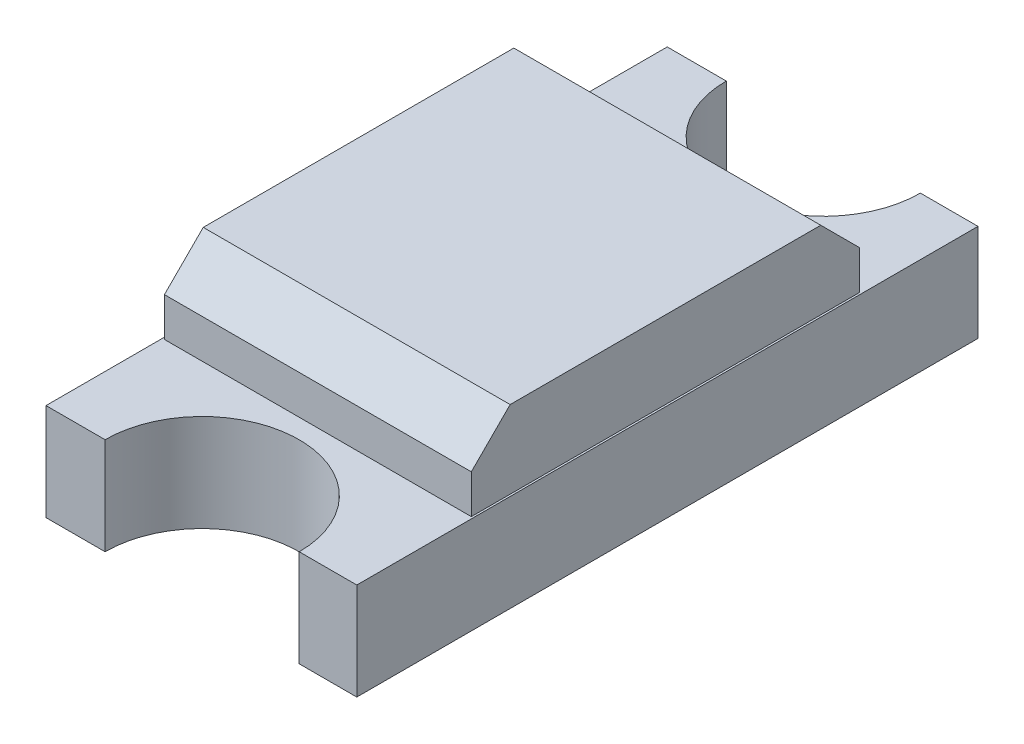
ISO-10303-21;
HEADER;
FILE_DESCRIPTION(('STEP AP214'),'2;1');
FILE_NAME('part.step','',(''),(''),'','','');
FILE_SCHEMA(('AUTOMOTIVE_DESIGN { 1 0 10303 214 1 1 1 1 }'));
ENDSEC;
DATA;
#1=APPLICATION_CONTEXT('core data for automotive mechanical design processes');
#2=APPLICATION_PROTOCOL_DEFINITION('international standard','automotive_design',2000,#1);
#3=PRODUCT_CONTEXT('',#1,'mechanical');
#4=PRODUCT('Part','Part','',(#3));
#5=PRODUCT_RELATED_PRODUCT_CATEGORY('part','',(#4));
#6=PRODUCT_DEFINITION_FORMATION('','',#4);
#7=PRODUCT_DEFINITION_CONTEXT('part definition',#1,'design');
#8=PRODUCT_DEFINITION('design','',#6,#7);
#9=PRODUCT_DEFINITION_SHAPE('','',#8);
#10=(LENGTH_UNIT() NAMED_UNIT(*) SI_UNIT(.MILLI.,.METRE.));
#11=(NAMED_UNIT(*) PLANE_ANGLE_UNIT() SI_UNIT($,.RADIAN.));
#12=(NAMED_UNIT(*) SI_UNIT($,.STERADIAN.) SOLID_ANGLE_UNIT());
#13=UNCERTAINTY_MEASURE_WITH_UNIT(LENGTH_MEASURE(1.E-05),#10,'distance_accuracy_value','');
#14=(GEOMETRIC_REPRESENTATION_CONTEXT(3) GLOBAL_UNCERTAINTY_ASSIGNED_CONTEXT((#13)) GLOBAL_UNIT_ASSIGNED_CONTEXT((#10,
#11,#12)) REPRESENTATION_CONTEXT('',''));
#15=CARTESIAN_POINT('',(0.,0.,0.));
#16=DIRECTION('',(0.,0.,1.));
#17=DIRECTION('',(1.,0.,0.));
#18=AXIS2_PLACEMENT_3D('',#15,#16,#17);
#19=CARTESIAN_POINT('',(0.,0.5,0.));
#20=DIRECTION('',(0.,-1.,0.));
#21=DIRECTION('',(0.,0.,-1.));
#22=AXIS2_PLACEMENT_3D('',#19,#20,#21);
#23=PLANE('',#22);
#24=CARTESIAN_POINT('',(0.,0.5,0.));
#25=DIRECTION('',(0.,-1.,0.));
#26=DIRECTION('',(0.,0.,-1.));
#27=AXIS2_PLACEMENT_3D('',#24,#25,#26);
#28=CIRCLE('',#27,0.5);
#29=CARTESIAN_POINT('',(0.5,0.5,0.));
#30=VERTEX_POINT('',#29);
#31=CARTESIAN_POINT('',(-0.5,0.5,0.));
#32=VERTEX_POINT('',#31);
#33=EDGE_CURVE('E168',#30,#32,#28,.T.);
#34=ORIENTED_EDGE('',*,*,#33,.T.);
#35=DIRECTION('',(-1.,0.,0.));
#36=VECTOR('',#35,1.);
#37=CARTESIAN_POINT('',(-0.5,0.5,0.));
#38=LINE('',#37,#36);
#39=CARTESIAN_POINT('',(-0.804342602210729,0.5,0.));
#40=VERTEX_POINT('',#39);
#41=EDGE_CURVE('E171',#32,#40,#38,.T.);
#42=ORIENTED_EDGE('',*,*,#41,.T.);
#43=DIRECTION('',(0.,0.,1.));
#44=VECTOR('',#43,1.);
#45=CARTESIAN_POINT('',(-0.804342602210729,0.5,0.));
#46=LINE('',#45,#44);
#47=CARTESIAN_POINT('',(-0.804342602210729,0.5,3.2));
#48=VERTEX_POINT('',#47);
#49=EDGE_CURVE('E174',#40,#48,#46,.T.);
#50=ORIENTED_EDGE('',*,*,#49,.T.);
#51=DIRECTION('',(1.,0.,0.));
#52=VECTOR('',#51,1.);
#53=CARTESIAN_POINT('',(-0.804342602210729,0.5,3.2));
#54=LINE('',#53,#52);
#55=CARTESIAN_POINT('',(-0.5,0.5,3.2));
#56=VERTEX_POINT('',#55);
#57=EDGE_CURVE('E176',#48,#56,#54,.T.);
#58=ORIENTED_EDGE('',*,*,#57,.T.);
#59=CARTESIAN_POINT('',(0.,0.5,3.2));
#60=DIRECTION('',(0.,-1.,0.));
#61=DIRECTION('',(0.,0.,1.));
#62=AXIS2_PLACEMENT_3D('',#59,#60,#61);
#63=CIRCLE('',#62,0.5);
#64=CARTESIAN_POINT('',(0.5,0.5,3.2));
#65=VERTEX_POINT('',#64);
#66=EDGE_CURVE('E178',#56,#65,#63,.T.);
#67=ORIENTED_EDGE('',*,*,#66,.T.);
#68=DIRECTION('',(1.,0.,0.));
#69=VECTOR('',#68,1.);
#70=CARTESIAN_POINT('',(0.796636626772628,0.5,3.2));
#71=LINE('',#70,#69);
#72=CARTESIAN_POINT('',(0.796636626772628,0.5,3.2));
#73=VERTEX_POINT('',#72);
#74=EDGE_CURVE('E180',#65,#73,#71,.T.);
#75=ORIENTED_EDGE('',*,*,#74,.T.);
#76=DIRECTION('',(0.,0.,-1.));
#77=VECTOR('',#76,1.);
#78=CARTESIAN_POINT('',(0.796636626772628,0.5,0.));
#79=LINE('',#78,#77);
#80=CARTESIAN_POINT('',(0.796636626772628,0.5,0.));
#81=VERTEX_POINT('',#80);
#82=EDGE_CURVE('E182',#73,#81,#79,.T.);
#83=ORIENTED_EDGE('',*,*,#82,.T.);
#84=DIRECTION('',(-1.,0.,0.));
#85=VECTOR('',#84,1.);
#86=CARTESIAN_POINT('',(0.5,0.5,0.));
#87=LINE('',#86,#85);
#88=EDGE_CURVE('E184',#81,#30,#87,.T.);
#89=ORIENTED_EDGE('',*,*,#88,.T.);
#90=EDGE_LOOP('',(#34,#42,#50,#58,#67,#75,#83,#89));
#91=FACE_BOUND('',#90,.T.);
#92=DIRECTION('',(0.,0.,1.));
#93=VECTOR('',#92,1.);
#94=CARTESIAN_POINT('',(-0.794342602210729,0.5,2.6));
#95=LINE('',#94,#93);
#96=CARTESIAN_POINT('',(-0.794342602210729,0.5,0.6));
#97=VERTEX_POINT('',#96);
#98=CARTESIAN_POINT('',(-0.794342602210729,0.5,2.6));
#99=VERTEX_POINT('',#98);
#100=EDGE_CURVE('E136',#97,#99,#95,.T.);
#101=ORIENTED_EDGE('',*,*,#100,.F.);
#102=DIRECTION('',(-1.,0.,0.));
#103=VECTOR('',#102,1.);
#104=CARTESIAN_POINT('',(-0.794342602210729,0.5,0.6));
#105=LINE('',#104,#103);
#106=CARTESIAN_POINT('',(0.786636626772628,0.5,0.6));
#107=VERTEX_POINT('',#106);
#108=EDGE_CURVE('E147',#107,#97,#105,.T.);
#109=ORIENTED_EDGE('',*,*,#108,.F.);
#110=DIRECTION('',(0.,0.,-1.));
#111=VECTOR('',#110,1.);
#112=CARTESIAN_POINT('',(0.786636626772628,0.5,2.6));
#113=LINE('',#112,#111);
#114=CARTESIAN_POINT('',(0.786636626772628,0.5,2.6));
#115=VERTEX_POINT('',#114);
#116=EDGE_CURVE('E155',#115,#107,#113,.T.);
#117=ORIENTED_EDGE('',*,*,#116,.F.);
#118=DIRECTION('',(1.,0.,0.));
#119=VECTOR('',#118,1.);
#120=CARTESIAN_POINT('',(-0.794342602210729,0.5,2.6));
#121=LINE('',#120,#119);
#122=EDGE_CURVE('E150',#99,#115,#121,.T.);
#123=ORIENTED_EDGE('',*,*,#122,.F.);
#124=EDGE_LOOP('',(#101,#109,#117,#123));
#125=FACE_BOUND('',#124,.T.);
#126=ADVANCED_FACE('F34',(#91,#125),#23,.F.);
#127=CARTESIAN_POINT('',(0.,0.5,0.));
#128=DIRECTION('',(0.,-1.,0.));
#129=DIRECTION('',(0.,0.,-1.));
#130=AXIS2_PLACEMENT_3D('',#127,#128,#129);
#131=CYLINDRICAL_SURFACE('',#130,0.5);
#132=CARTESIAN_POINT('',(0.,0.,0.));
#133=DIRECTION('',(0.,-1.,0.));
#134=DIRECTION('',(0.,0.,-1.));
#135=AXIS2_PLACEMENT_3D('',#132,#133,#134);
#136=CIRCLE('',#135,0.5);
#137=CARTESIAN_POINT('',(0.5,0.,0.));
#138=VERTEX_POINT('',#137);
#139=CARTESIAN_POINT('',(-0.5,0.,0.));
#140=VERTEX_POINT('',#139);
#141=EDGE_CURVE('E167',#138,#140,#136,.T.);
#142=ORIENTED_EDGE('',*,*,#141,.T.);
#143=DIRECTION('',(0.,-1.,0.));
#144=VECTOR('',#143,1.);
#145=CARTESIAN_POINT('',(-0.5,0.5,0.));
#146=LINE('',#145,#144);
#147=EDGE_CURVE('E222',#32,#140,#146,.T.);
#148=ORIENTED_EDGE('',*,*,#147,.F.);
#149=ORIENTED_EDGE('',*,*,#33,.F.);
#150=DIRECTION('',(0.,-1.,0.));
#151=VECTOR('',#150,1.);
#152=CARTESIAN_POINT('',(0.5,0.5,0.));
#153=LINE('',#152,#151);
#154=EDGE_CURVE('E186',#30,#138,#153,.T.);
#155=ORIENTED_EDGE('',*,*,#154,.T.);
#156=EDGE_LOOP('',(#142,#148,#149,#155));
#157=FACE_BOUND('',#156,.T.);
#158=ADVANCED_FACE('F256',(#157),#131,.F.);
#159=CARTESIAN_POINT('',(-0.5,0.5,0.));
#160=DIRECTION('',(0.,0.,1.));
#161=DIRECTION('',(1.,0.,0.));
#162=AXIS2_PLACEMENT_3D('',#159,#160,#161);
#163=PLANE('',#162);
#164=DIRECTION('',(-1.,0.,0.));
#165=VECTOR('',#164,1.);
#166=CARTESIAN_POINT('',(-0.5,0.,0.));
#167=LINE('',#166,#165);
#168=CARTESIAN_POINT('',(-0.804342602210729,0.,0.));
#169=VERTEX_POINT('',#168);
#170=EDGE_CURVE('E189',#140,#169,#167,.T.);
#171=ORIENTED_EDGE('',*,*,#170,.T.);
#172=DIRECTION('',(0.,-1.,0.));
#173=VECTOR('',#172,1.);
#174=CARTESIAN_POINT('',(-0.804342602210729,0.5,0.));
#175=LINE('',#174,#173);
#176=EDGE_CURVE('E219',#40,#169,#175,.T.);
#177=ORIENTED_EDGE('',*,*,#176,.F.);
#178=ORIENTED_EDGE('',*,*,#41,.F.);
#179=ORIENTED_EDGE('',*,*,#147,.T.);
#180=EDGE_LOOP('',(#171,#177,#178,#179));
#181=FACE_BOUND('',#180,.T.);
#182=ADVANCED_FACE('F262',(#181),#163,.F.);
#183=CARTESIAN_POINT('',(-0.804342602210729,0.5,0.));
#184=DIRECTION('',(1.,0.,0.));
#185=DIRECTION('',(0.,0.,-1.));
#186=AXIS2_PLACEMENT_3D('',#183,#184,#185);
#187=PLANE('',#186);
#188=DIRECTION('',(0.,0.,1.));
#189=VECTOR('',#188,1.);
#190=CARTESIAN_POINT('',(-0.804342602210729,0.,0.));
#191=LINE('',#190,#189);
#192=CARTESIAN_POINT('',(-0.804342602210729,0.,3.2));
#193=VERTEX_POINT('',#192);
#194=EDGE_CURVE('E191',#169,#193,#191,.T.);
#195=ORIENTED_EDGE('',*,*,#194,.T.);
#196=DIRECTION('',(0.,-1.,0.));
#197=VECTOR('',#196,1.);
#198=CARTESIAN_POINT('',(-0.804342602210729,0.5,3.2));
#199=LINE('',#198,#197);
#200=EDGE_CURVE('E216',#48,#193,#199,.T.);
#201=ORIENTED_EDGE('',*,*,#200,.F.);
#202=ORIENTED_EDGE('',*,*,#49,.F.);
#203=ORIENTED_EDGE('',*,*,#176,.T.);
#204=EDGE_LOOP('',(#195,#201,#202,#203));
#205=FACE_BOUND('',#204,.T.);
#206=ADVANCED_FACE('F291',(#205),#187,.F.);
#207=CARTESIAN_POINT('',(-0.804342602210729,0.5,3.2));
#208=DIRECTION('',(0.,0.,-1.));
#209=DIRECTION('',(-1.,0.,0.));
#210=AXIS2_PLACEMENT_3D('',#207,#208,#209);
#211=PLANE('',#210);
#212=DIRECTION('',(1.,0.,0.));
#213=VECTOR('',#212,1.);
#214=CARTESIAN_POINT('',(-0.804342602210729,0.,3.2));
#215=LINE('',#214,#213);
#216=CARTESIAN_POINT('',(-0.5,0.,3.2));
#217=VERTEX_POINT('',#216);
#218=EDGE_CURVE('E193',#193,#217,#215,.T.);
#219=ORIENTED_EDGE('',*,*,#218,.T.);
#220=DIRECTION('',(0.,-1.,0.));
#221=VECTOR('',#220,1.);
#222=CARTESIAN_POINT('',(-0.5,0.5,3.2));
#223=LINE('',#222,#221);
#224=EDGE_CURVE('E213',#56,#217,#223,.T.);
#225=ORIENTED_EDGE('',*,*,#224,.F.);
#226=ORIENTED_EDGE('',*,*,#57,.F.);
#227=ORIENTED_EDGE('',*,*,#200,.T.);
#228=EDGE_LOOP('',(#219,#225,#226,#227));
#229=FACE_BOUND('',#228,.T.);
#230=ADVANCED_FACE('F287',(#229),#211,.F.);
#231=CARTESIAN_POINT('',(0.,0.5,3.2));
#232=DIRECTION('',(0.,-1.,0.));
#233=DIRECTION('',(0.,0.,-1.));
#234=AXIS2_PLACEMENT_3D('',#231,#232,#233);
#235=CYLINDRICAL_SURFACE('',#234,0.5);
#236=CARTESIAN_POINT('',(0.,0.,3.2));
#237=DIRECTION('',(0.,-1.,0.));
#238=DIRECTION('',(0.,0.,1.));
#239=AXIS2_PLACEMENT_3D('',#236,#237,#238);
#240=CIRCLE('',#239,0.5);
#241=CARTESIAN_POINT('',(0.5,0.,3.2));
#242=VERTEX_POINT('',#241);
#243=EDGE_CURVE('E195',#217,#242,#240,.T.);
#244=ORIENTED_EDGE('',*,*,#243,.T.);
#245=DIRECTION('',(0.,-1.,0.));
#246=VECTOR('',#245,1.);
#247=CARTESIAN_POINT('',(0.5,0.5,3.2));
#248=LINE('',#247,#246);
#249=EDGE_CURVE('E210',#65,#242,#248,.T.);
#250=ORIENTED_EDGE('',*,*,#249,.F.);
#251=ORIENTED_EDGE('',*,*,#66,.F.);
#252=ORIENTED_EDGE('',*,*,#224,.T.);
#253=EDGE_LOOP('',(#244,#250,#251,#252));
#254=FACE_BOUND('',#253,.T.);
#255=ADVANCED_FACE('F283',(#254),#235,.F.);
#256=CARTESIAN_POINT('',(0.796636626772628,0.5,3.2));
#257=DIRECTION('',(0.,0.,-1.));
#258=DIRECTION('',(-1.,0.,0.));
#259=AXIS2_PLACEMENT_3D('',#256,#257,#258);
#260=PLANE('',#259);
#261=DIRECTION('',(1.,0.,0.));
#262=VECTOR('',#261,1.);
#263=CARTESIAN_POINT('',(0.796636626772628,0.,3.2));
#264=LINE('',#263,#262);
#265=CARTESIAN_POINT('',(0.796636626772628,0.,3.2));
#266=VERTEX_POINT('',#265);
#267=EDGE_CURVE('E197',#242,#266,#264,.T.);
#268=ORIENTED_EDGE('',*,*,#267,.T.);
#269=DIRECTION('',(0.,-1.,0.));
#270=VECTOR('',#269,1.);
#271=CARTESIAN_POINT('',(0.796636626772628,0.5,3.2));
#272=LINE('',#271,#270);
#273=EDGE_CURVE('E207',#73,#266,#272,.T.);
#274=ORIENTED_EDGE('',*,*,#273,.F.);
#275=ORIENTED_EDGE('',*,*,#74,.F.);
#276=ORIENTED_EDGE('',*,*,#249,.T.);
#277=EDGE_LOOP('',(#268,#274,#275,#276));
#278=FACE_BOUND('',#277,.T.);
#279=ADVANCED_FACE('F279',(#278),#260,.F.);
#280=CARTESIAN_POINT('',(0.796636626772628,0.5,0.));
#281=DIRECTION('',(-1.,0.,0.));
#282=DIRECTION('',(0.,0.,1.));
#283=AXIS2_PLACEMENT_3D('',#280,#281,#282);
#284=PLANE('',#283);
#285=DIRECTION('',(0.,0.,-1.));
#286=VECTOR('',#285,1.);
#287=CARTESIAN_POINT('',(0.796636626772628,0.,0.));
#288=LINE('',#287,#286);
#289=CARTESIAN_POINT('',(0.796636626772628,0.,0.));
#290=VERTEX_POINT('',#289);
#291=EDGE_CURVE('E199',#266,#290,#288,.T.);
#292=ORIENTED_EDGE('',*,*,#291,.T.);
#293=DIRECTION('',(0.,-1.,0.));
#294=VECTOR('',#293,1.);
#295=CARTESIAN_POINT('',(0.796636626772628,0.5,0.));
#296=LINE('',#295,#294);
#297=EDGE_CURVE('E204',#81,#290,#296,.T.);
#298=ORIENTED_EDGE('',*,*,#297,.F.);
#299=ORIENTED_EDGE('',*,*,#82,.F.);
#300=ORIENTED_EDGE('',*,*,#273,.T.);
#301=EDGE_LOOP('',(#292,#298,#299,#300));
#302=FACE_BOUND('',#301,.T.);
#303=ADVANCED_FACE('F275',(#302),#284,.F.);
#304=CARTESIAN_POINT('',(0.5,0.5,0.));
#305=DIRECTION('',(0.,0.,1.));
#306=DIRECTION('',(1.,0.,0.));
#307=AXIS2_PLACEMENT_3D('',#304,#305,#306);
#308=PLANE('',#307);
#309=DIRECTION('',(-1.,0.,0.));
#310=VECTOR('',#309,1.);
#311=CARTESIAN_POINT('',(0.5,0.,0.));
#312=LINE('',#311,#310);
#313=EDGE_CURVE('E172',#290,#138,#312,.T.);
#314=ORIENTED_EDGE('',*,*,#313,.T.);
#315=ORIENTED_EDGE('',*,*,#154,.F.);
#316=ORIENTED_EDGE('',*,*,#88,.F.);
#317=ORIENTED_EDGE('',*,*,#297,.T.);
#318=EDGE_LOOP('',(#314,#315,#316,#317));
#319=FACE_BOUND('',#318,.T.);
#320=ADVANCED_FACE('F271',(#319),#308,.F.);
#321=CARTESIAN_POINT('',(0.,0.,0.));
#322=DIRECTION('',(0.,-1.,0.));
#323=DIRECTION('',(0.,0.,-1.));
#324=AXIS2_PLACEMENT_3D('',#321,#322,#323);
#325=PLANE('',#324);
#326=ORIENTED_EDGE('',*,*,#141,.F.);
#327=ORIENTED_EDGE('',*,*,#313,.F.);
#328=ORIENTED_EDGE('',*,*,#291,.F.);
#329=ORIENTED_EDGE('',*,*,#267,.F.);
#330=ORIENTED_EDGE('',*,*,#243,.F.);
#331=ORIENTED_EDGE('',*,*,#218,.F.);
#332=ORIENTED_EDGE('',*,*,#194,.F.);
#333=ORIENTED_EDGE('',*,*,#170,.F.);
#334=EDGE_LOOP('',(#326,#327,#328,#329,#330,#331,#332,#333));
#335=FACE_BOUND('',#334,.T.);
#336=ADVANCED_FACE('F268',(#335),#325,.T.);
#337=CARTESIAN_POINT('',(-0.794342602210729,0.9,2.6));
#338=DIRECTION('',(1.,0.,0.));
#339=DIRECTION('',(0.,0.,-1.));
#340=AXIS2_PLACEMENT_3D('',#337,#338,#339);
#341=PLANE('',#340);
#342=DIRECTION('',(0.,-1.,0.));
#343=VECTOR('',#342,1.);
#344=CARTESIAN_POINT('',(-0.794342602210729,0.9,2.6));
#345=LINE('',#344,#343);
#346=CARTESIAN_POINT('',(-0.794342602210729,0.699999999999999,2.6));
#347=VERTEX_POINT('',#346);
#348=EDGE_CURVE('E165',#347,#99,#345,.T.);
#349=ORIENTED_EDGE('',*,*,#348,.F.);
#350=DIRECTION('',(0.,-0.70710678118655,0.707106781186545));
#351=VECTOR('',#350,1.);
#352=CARTESIAN_POINT('',(-0.794342602210729,0.9,2.4));
#353=LINE('',#352,#351);
#354=CARTESIAN_POINT('',(-0.794342602210729,0.9,2.4));
#355=VERTEX_POINT('',#354);
#356=EDGE_CURVE('E42',#347,#355,#353,.F.);
#357=ORIENTED_EDGE('',*,*,#356,.T.);
#358=DIRECTION('',(0.,0.,1.));
#359=VECTOR('',#358,1.);
#360=CARTESIAN_POINT('',(-0.794342602210729,0.9,2.6));
#361=LINE('',#360,#359);
#362=CARTESIAN_POINT('',(-0.794342602210729,0.9,0.800000000000001));
#363=VERTEX_POINT('',#362);
#364=EDGE_CURVE('E154',#363,#355,#361,.T.);
#365=ORIENTED_EDGE('',*,*,#364,.F.);
#366=DIRECTION('',(0.,0.707106781186548,0.707106781186547));
#367=VECTOR('',#366,1.);
#368=CARTESIAN_POINT('',(-0.794342602210729,0.9,0.8));
#369=LINE('',#368,#367);
#370=CARTESIAN_POINT('',(-0.794342602210729,0.699999999999999,0.6));
#371=VERTEX_POINT('',#370);
#372=EDGE_CURVE('E49',#363,#371,#369,.F.);
#373=ORIENTED_EDGE('',*,*,#372,.T.);
#374=DIRECTION('',(0.,-1.,0.));
#375=VECTOR('',#374,1.);
#376=CARTESIAN_POINT('',(-0.794342602210729,0.9,0.6));
#377=LINE('',#376,#375);
#378=EDGE_CURVE('E133',#371,#97,#377,.T.);
#379=ORIENTED_EDGE('',*,*,#378,.T.);
#380=ORIENTED_EDGE('',*,*,#100,.T.);
#381=EDGE_LOOP('',(#349,#357,#365,#373,#379,#380));
#382=FACE_BOUND('',#381,.T.);
#383=ADVANCED_FACE('F135',(#382),#341,.F.);
#384=CARTESIAN_POINT('',(-0.794342602210729,0.9,2.6));
#385=DIRECTION('',(0.,0.,-1.));
#386=DIRECTION('',(-1.,0.,0.));
#387=AXIS2_PLACEMENT_3D('',#384,#385,#386);
#388=PLANE('',#387);
#389=DIRECTION('',(0.,-1.,0.));
#390=VECTOR('',#389,1.);
#391=CARTESIAN_POINT('',(0.786636626772628,0.9,2.6));
#392=LINE('',#391,#390);
#393=CARTESIAN_POINT('',(0.786636626772628,0.699999999999999,2.6));
#394=VERTEX_POINT('',#393);
#395=EDGE_CURVE('E163',#394,#115,#392,.T.);
#396=ORIENTED_EDGE('',*,*,#395,.F.);
#397=DIRECTION('',(-1.,0.,0.));
#398=VECTOR('',#397,1.);
#399=CARTESIAN_POINT('',(-0.794342602210729,0.699999999999999,2.6));
#400=LINE('',#399,#398);
#401=EDGE_CURVE('E57',#394,#347,#400,.T.);
#402=ORIENTED_EDGE('',*,*,#401,.T.);
#403=ORIENTED_EDGE('',*,*,#348,.T.);
#404=ORIENTED_EDGE('',*,*,#122,.T.);
#405=EDGE_LOOP('',(#396,#402,#403,#404));
#406=FACE_BOUND('',#405,.T.);
#407=ADVANCED_FACE('F247',(#406),#388,.F.);
#408=CARTESIAN_POINT('',(0.786636626772628,0.9,2.6));
#409=DIRECTION('',(-1.,0.,0.));
#410=DIRECTION('',(0.,0.,1.));
#411=AXIS2_PLACEMENT_3D('',#408,#409,#410);
#412=PLANE('',#411);
#413=DIRECTION('',(0.,0.,-1.));
#414=VECTOR('',#413,1.);
#415=CARTESIAN_POINT('',(0.786636626772628,0.9,2.6));
#416=LINE('',#415,#414);
#417=CARTESIAN_POINT('',(0.786636626772628,0.9,2.4));
#418=VERTEX_POINT('',#417);
#419=CARTESIAN_POINT('',(0.786636626772628,0.9,0.800000000000001));
#420=VERTEX_POINT('',#419);
#421=EDGE_CURVE('E141',#418,#420,#416,.T.);
#422=ORIENTED_EDGE('',*,*,#421,.F.);
#423=DIRECTION('',(0.,0.70710678118655,-0.707106781186545));
#424=VECTOR('',#423,1.);
#425=CARTESIAN_POINT('',(0.786636626772628,0.9,2.4));
#426=LINE('',#425,#424);
#427=EDGE_CURVE('E233',#418,#394,#426,.F.);
#428=ORIENTED_EDGE('',*,*,#427,.T.);
#429=ORIENTED_EDGE('',*,*,#395,.T.);
#430=ORIENTED_EDGE('',*,*,#116,.T.);
#431=DIRECTION('',(0.,-1.,0.));
#432=VECTOR('',#431,1.);
#433=CARTESIAN_POINT('',(0.786636626772628,0.9,0.6));
#434=LINE('',#433,#432);
#435=CARTESIAN_POINT('',(0.786636626772628,0.699999999999999,0.6));
#436=VERTEX_POINT('',#435);
#437=EDGE_CURVE('E140',#436,#107,#434,.T.);
#438=ORIENTED_EDGE('',*,*,#437,.F.);
#439=DIRECTION('',(0.,-0.707106781186548,-0.707106781186547));
#440=VECTOR('',#439,1.);
#441=CARTESIAN_POINT('',(0.786636626772628,0.9,0.8));
#442=LINE('',#441,#440);
#443=EDGE_CURVE('E231',#436,#420,#442,.F.);
#444=ORIENTED_EDGE('',*,*,#443,.T.);
#445=EDGE_LOOP('',(#422,#428,#429,#430,#438,#444));
#446=FACE_BOUND('',#445,.T.);
#447=ADVANCED_FACE('F246',(#446),#412,.F.);
#448=CARTESIAN_POINT('',(-0.794342602210729,0.9,0.6));
#449=DIRECTION('',(0.,0.,1.));
#450=DIRECTION('',(1.,0.,0.));
#451=AXIS2_PLACEMENT_3D('',#448,#449,#450);
#452=PLANE('',#451);
#453=ORIENTED_EDGE('',*,*,#378,.F.);
#454=DIRECTION('',(1.,0.,0.));
#455=VECTOR('',#454,1.);
#456=CARTESIAN_POINT('',(-0.794342602210729,0.699999999999999,0.6));
#457=LINE('',#456,#455);
#458=EDGE_CURVE('E11',#371,#436,#457,.T.);
#459=ORIENTED_EDGE('',*,*,#458,.T.);
#460=ORIENTED_EDGE('',*,*,#437,.T.);
#461=ORIENTED_EDGE('',*,*,#108,.T.);
#462=EDGE_LOOP('',(#453,#459,#460,#461));
#463=FACE_BOUND('',#462,.T.);
#464=ADVANCED_FACE('F152',(#463),#452,.F.);
#465=CARTESIAN_POINT('',(0.,0.9,0.));
#466=DIRECTION('',(0.,-1.,0.));
#467=DIRECTION('',(0.,0.,-1.));
#468=AXIS2_PLACEMENT_3D('',#465,#466,#467);
#469=PLANE('',#468);
#470=ORIENTED_EDGE('',*,*,#364,.T.);
#471=DIRECTION('',(1.,0.,0.));
#472=VECTOR('',#471,1.);
#473=CARTESIAN_POINT('',(0.,0.9,2.4));
#474=LINE('',#473,#472);
#475=EDGE_CURVE('E228',#355,#418,#474,.T.);
#476=ORIENTED_EDGE('',*,*,#475,.T.);
#477=ORIENTED_EDGE('',*,*,#421,.T.);
#478=DIRECTION('',(-1.,0.,0.));
#479=VECTOR('',#478,1.);
#480=CARTESIAN_POINT('',(0.,0.9,0.8));
#481=LINE('',#480,#479);
#482=EDGE_CURVE('E225',#420,#363,#481,.T.);
#483=ORIENTED_EDGE('',*,*,#482,.T.);
#484=EDGE_LOOP('',(#470,#476,#477,#483));
#485=FACE_BOUND('',#484,.T.);
#486=ADVANCED_FACE('F240',(#485),#469,.F.);
#487=CARTESIAN_POINT('',(0.,0.9,2.4));
#488=DIRECTION('',(0.,-0.707106781186545,-0.70710678118655));
#489=DIRECTION('',(1.,0.,0.));
#490=AXIS2_PLACEMENT_3D('',#487,#488,#489);
#491=PLANE('',#490);
#492=ORIENTED_EDGE('',*,*,#356,.F.);
#493=ORIENTED_EDGE('',*,*,#401,.F.);
#494=ORIENTED_EDGE('',*,*,#427,.F.);
#495=ORIENTED_EDGE('',*,*,#475,.F.);
#496=EDGE_LOOP('',(#492,#493,#494,#495));
#497=FACE_BOUND('',#496,.T.);
#498=ADVANCED_FACE('F244',(#497),#491,.F.);
#499=CARTESIAN_POINT('',(0.,0.9,0.8));
#500=DIRECTION('',(0.,-0.707106781186547,0.707106781186548));
#501=DIRECTION('',(-1.,0.,0.));
#502=AXIS2_PLACEMENT_3D('',#499,#500,#501);
#503=PLANE('',#502);
#504=ORIENTED_EDGE('',*,*,#443,.F.);
#505=ORIENTED_EDGE('',*,*,#458,.F.);
#506=ORIENTED_EDGE('',*,*,#372,.F.);
#507=ORIENTED_EDGE('',*,*,#482,.F.);
#508=EDGE_LOOP('',(#504,#505,#506,#507));
#509=FACE_BOUND('',#508,.T.);
#510=ADVANCED_FACE('F36',(#509),#503,.F.);
#511=CLOSED_SHELL('',(#126,#158,#182,#206,#230,#255,#279,#303,#320,#336,#383,#407,#447,#464,
#486,#498,#510));
#512=MANIFOLD_SOLID_BREP('B2',#511);
#513=ADVANCED_BREP_SHAPE_REPRESENTATION('',(#18,#512),#14);
#514=SHAPE_DEFINITION_REPRESENTATION(#9,#513);
ENDSEC;
END-ISO-10303-21;
